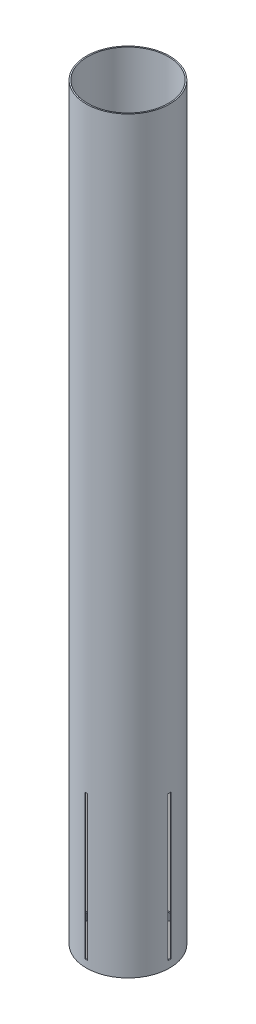
ISO-10303-21;
HEADER;
FILE_DESCRIPTION(('STEP AP214'),'2;1');
FILE_NAME('part.step','',(''),(''),'','','');
FILE_SCHEMA(('AUTOMOTIVE_DESIGN { 1 0 10303 214 1 1 1 1 }'));
ENDSEC;
DATA;
#1=APPLICATION_CONTEXT('core data for automotive mechanical design processes');
#2=APPLICATION_PROTOCOL_DEFINITION('international standard','automotive_design',2000,#1);
#3=PRODUCT_CONTEXT('',#1,'mechanical');
#4=PRODUCT('Part','Part','',(#3));
#5=PRODUCT_RELATED_PRODUCT_CATEGORY('part','',(#4));
#6=PRODUCT_DEFINITION_FORMATION('','',#4);
#7=PRODUCT_DEFINITION_CONTEXT('part definition',#1,'design');
#8=PRODUCT_DEFINITION('design','',#6,#7);
#9=PRODUCT_DEFINITION_SHAPE('','',#8);
#10=(LENGTH_UNIT() NAMED_UNIT(*) SI_UNIT(.MILLI.,.METRE.));
#11=(NAMED_UNIT(*) PLANE_ANGLE_UNIT() SI_UNIT($,.RADIAN.));
#12=(NAMED_UNIT(*) SI_UNIT($,.STERADIAN.) SOLID_ANGLE_UNIT());
#13=UNCERTAINTY_MEASURE_WITH_UNIT(LENGTH_MEASURE(1.E-05),#10,'distance_accuracy_value','');
#14=(GEOMETRIC_REPRESENTATION_CONTEXT(3) GLOBAL_UNCERTAINTY_ASSIGNED_CONTEXT((#13)) GLOBAL_UNIT_ASSIGNED_CONTEXT((#10,
#11,#12)) REPRESENTATION_CONTEXT('',''));
#15=CARTESIAN_POINT('',(0.,0.,0.));
#16=DIRECTION('',(0.,0.,1.));
#17=DIRECTION('',(1.,0.,0.));
#18=AXIS2_PLACEMENT_3D('',#15,#16,#17);
#19=CARTESIAN_POINT('',(0.,-725.,0.));
#20=DIRECTION('',(0.,1.,0.));
#21=DIRECTION('',(0.,0.,1.));
#22=AXIS2_PLACEMENT_3D('',#19,#20,#21);
#23=CYLINDRICAL_SURFACE('',#22,80.75);
#24=CARTESIAN_POINT('',(0.,-431.,0.));
#25=DIRECTION('',(0.,1.,0.));
#26=DIRECTION('',(0.,0.,1.));
#27=AXIS2_PLACEMENT_3D('',#24,#25,#26);
#28=CIRCLE('',#27,80.75);
#29=CARTESIAN_POINT('',(80.7031597894407,-431.,-2.74999999999972));
#30=VERTEX_POINT('',#29);
#31=CARTESIAN_POINT('',(80.7031597894407,-431.,2.75000000000028));
#32=VERTEX_POINT('',#31);
#33=EDGE_CURVE('E183',#30,#32,#28,.F.);
#34=ORIENTED_EDGE('',*,*,#33,.F.);
#35=DIRECTION('',(0.,1.,0.));
#36=VECTOR('',#35,1.);
#37=CARTESIAN_POINT('',(80.7031597894407,-725.,-2.74999999999972));
#38=LINE('',#37,#36);
#39=CARTESIAN_POINT('',(80.7031597894407,-711.,-2.74999999999972));
#40=VERTEX_POINT('',#39);
#41=EDGE_CURVE('E161',#40,#30,#38,.T.);
#42=ORIENTED_EDGE('',*,*,#41,.F.);
#43=CARTESIAN_POINT('',(0.,-711.,0.));
#44=DIRECTION('',(0.,-1.,0.));
#45=DIRECTION('',(0.,0.,-1.));
#46=AXIS2_PLACEMENT_3D('',#43,#44,#45);
#47=CIRCLE('',#46,80.75);
#48=CARTESIAN_POINT('',(80.7031597894407,-711.,2.75000000000028));
#49=VERTEX_POINT('',#48);
#50=EDGE_CURVE('E165',#49,#40,#47,.F.);
#51=ORIENTED_EDGE('',*,*,#50,.F.);
#52=DIRECTION('',(0.,1.,0.));
#53=VECTOR('',#52,1.);
#54=CARTESIAN_POINT('',(80.7031597894407,-725.,2.75000000000028));
#55=LINE('',#54,#53);
#56=EDGE_CURVE('E151',#32,#49,#55,.F.);
#57=ORIENTED_EDGE('',*,*,#56,.F.);
#58=EDGE_LOOP('',(#34,#42,#51,#57));
#59=FACE_BOUND('',#58,.T.);
#60=CARTESIAN_POINT('',(-80.7031597894407,-711.,-2.75000000000028));
#61=VERTEX_POINT('',#60);
#62=CARTESIAN_POINT('',(-80.7031597894407,-711.,2.74999999999972));
#63=VERTEX_POINT('',#62);
#64=EDGE_CURVE('E172',#61,#63,#47,.F.);
#65=ORIENTED_EDGE('',*,*,#64,.F.);
#66=DIRECTION('',(0.,1.,0.));
#67=VECTOR('',#66,1.);
#68=CARTESIAN_POINT('',(-80.7031597894407,-725.,-2.75000000000028));
#69=LINE('',#68,#67);
#70=CARTESIAN_POINT('',(-80.7031597894407,-431.,-2.75000000000028));
#71=VERTEX_POINT('',#70);
#72=EDGE_CURVE('E162',#71,#61,#69,.F.);
#73=ORIENTED_EDGE('',*,*,#72,.F.);
#74=CARTESIAN_POINT('',(-80.7031597894407,-431.,2.74999999999972));
#75=VERTEX_POINT('',#74);
#76=EDGE_CURVE('E184',#75,#71,#28,.F.);
#77=ORIENTED_EDGE('',*,*,#76,.F.);
#78=DIRECTION('',(0.,1.,0.));
#79=VECTOR('',#78,1.);
#80=CARTESIAN_POINT('',(-80.7031597894407,-725.,2.74999999999972));
#81=LINE('',#80,#79);
#82=EDGE_CURVE('E186',#63,#75,#81,.T.);
#83=ORIENTED_EDGE('',*,*,#82,.F.);
#84=EDGE_LOOP('',(#65,#73,#77,#83));
#85=FACE_BOUND('',#84,.T.);
#86=CARTESIAN_POINT('',(0.,-711.,0.));
#87=DIRECTION('',(0.,-1.,0.));
#88=DIRECTION('',(0.,0.,-1.));
#89=AXIS2_PLACEMENT_3D('',#86,#87,#88);
#90=CIRCLE('',#89,80.75);
#91=CARTESIAN_POINT('',(2.75,-711.,-80.7031597894407));
#92=VERTEX_POINT('',#91);
#93=CARTESIAN_POINT('',(-2.75,-711.,-80.7031597894407));
#94=VERTEX_POINT('',#93);
#95=EDGE_CURVE('E209',#92,#94,#90,.F.);
#96=ORIENTED_EDGE('',*,*,#95,.F.);
#97=DIRECTION('',(0.,1.,0.));
#98=VECTOR('',#97,1.);
#99=CARTESIAN_POINT('',(2.75,-725.,-80.7031597894407));
#100=LINE('',#99,#98);
#101=CARTESIAN_POINT('',(2.75,-431.,-80.7031597894407));
#102=VERTEX_POINT('',#101);
#103=EDGE_CURVE('E212',#102,#92,#100,.F.);
#104=ORIENTED_EDGE('',*,*,#103,.F.);
#105=CARTESIAN_POINT('',(0.,-431.,0.));
#106=DIRECTION('',(0.,1.,0.));
#107=DIRECTION('',(0.,0.,1.));
#108=AXIS2_PLACEMENT_3D('',#105,#106,#107);
#109=CIRCLE('',#108,80.75);
#110=CARTESIAN_POINT('',(-2.75,-431.,-80.7031597894407));
#111=VERTEX_POINT('',#110);
#112=EDGE_CURVE('E216',#111,#102,#109,.F.);
#113=ORIENTED_EDGE('',*,*,#112,.F.);
#114=DIRECTION('',(0.,1.,0.));
#115=VECTOR('',#114,1.);
#116=CARTESIAN_POINT('',(-2.75,-725.,-80.7031597894407));
#117=LINE('',#116,#115);
#118=EDGE_CURVE('E218',#94,#111,#117,.T.);
#119=ORIENTED_EDGE('',*,*,#118,.F.);
#120=EDGE_LOOP('',(#96,#104,#113,#119));
#121=FACE_BOUND('',#120,.T.);
#122=CARTESIAN_POINT('',(-2.75,-711.,80.7031597894407));
#123=VERTEX_POINT('',#122);
#124=CARTESIAN_POINT('',(2.75,-711.,80.7031597894407));
#125=VERTEX_POINT('',#124);
#126=EDGE_CURVE('E206',#123,#125,#90,.F.);
#127=ORIENTED_EDGE('',*,*,#126,.F.);
#128=DIRECTION('',(0.,1.,0.));
#129=VECTOR('',#128,1.);
#130=CARTESIAN_POINT('',(-2.75,-725.,80.7031597894407));
#131=LINE('',#130,#129);
#132=CARTESIAN_POINT('',(-2.75,-431.,80.7031597894407));
#133=VERTEX_POINT('',#132);
#134=EDGE_CURVE('E220',#133,#123,#131,.F.);
#135=ORIENTED_EDGE('',*,*,#134,.F.);
#136=CARTESIAN_POINT('',(2.75,-431.,80.7031597894407));
#137=VERTEX_POINT('',#136);
#138=EDGE_CURVE('E215',#137,#133,#109,.F.);
#139=ORIENTED_EDGE('',*,*,#138,.F.);
#140=DIRECTION('',(0.,1.,0.));
#141=VECTOR('',#140,1.);
#142=CARTESIAN_POINT('',(2.75,-725.,80.7031597894407));
#143=LINE('',#142,#141);
#144=EDGE_CURVE('E208',#125,#137,#143,.T.);
#145=ORIENTED_EDGE('',*,*,#144,.F.);
#146=EDGE_LOOP('',(#127,#135,#139,#145));
#147=FACE_BOUND('',#146,.T.);
#148=CARTESIAN_POINT('',(0.,-725.,0.));
#149=DIRECTION('',(0.,1.,0.));
#150=DIRECTION('',(0.,0.,1.));
#151=AXIS2_PLACEMENT_3D('',#148,#149,#150);
#152=CIRCLE('',#151,80.75);
#153=CARTESIAN_POINT('',(0.,-725.,80.75));
#154=VERTEX_POINT('',#153);
#155=EDGE_CURVE('E231',#154,#154,#152,.T.);
#156=ORIENTED_EDGE('',*,*,#155,.T.);
#157=EDGE_LOOP('',(#156));
#158=FACE_BOUND('',#157,.T.);
#159=CARTESIAN_POINT('',(0.,725.,0.));
#160=DIRECTION('',(0.,1.,0.));
#161=DIRECTION('',(0.,0.,1.));
#162=AXIS2_PLACEMENT_3D('',#159,#160,#161);
#163=CIRCLE('',#162,80.75);
#164=CARTESIAN_POINT('',(0.,725.,80.75));
#165=VERTEX_POINT('',#164);
#166=EDGE_CURVE('E225',#165,#165,#163,.T.);
#167=ORIENTED_EDGE('',*,*,#166,.F.);
#168=EDGE_LOOP('',(#167));
#169=FACE_BOUND('',#168,.T.);
#170=ADVANCED_FACE('F38',(#59,#85,#121,#147,#158,#169),#23,.T.);
#171=CARTESIAN_POINT('',(0.,-725.,0.));
#172=DIRECTION('',(0.,1.,0.));
#173=DIRECTION('',(0.,0.,1.));
#174=AXIS2_PLACEMENT_3D('',#171,#172,#173);
#175=PLANE('',#174);
#176=CARTESIAN_POINT('',(0.,-725.,0.));
#177=DIRECTION('',(0.,1.,0.));
#178=DIRECTION('',(0.,0.,1.));
#179=AXIS2_PLACEMENT_3D('',#176,#177,#178);
#180=CIRCLE('',#179,78.35);
#181=CARTESIAN_POINT('',(0.,-725.,78.35));
#182=VERTEX_POINT('',#181);
#183=EDGE_CURVE('E228',#182,#182,#180,.T.);
#184=ORIENTED_EDGE('',*,*,#183,.T.);
#185=EDGE_LOOP('',(#184));
#186=FACE_BOUND('',#185,.T.);
#187=ORIENTED_EDGE('',*,*,#155,.F.);
#188=EDGE_LOOP('',(#187));
#189=FACE_BOUND('',#188,.T.);
#190=ADVANCED_FACE('F304',(#186,#189),#175,.F.);
#191=CARTESIAN_POINT('',(0.,-725.,0.));
#192=DIRECTION('',(0.,1.,0.));
#193=DIRECTION('',(0.,0.,1.));
#194=AXIS2_PLACEMENT_3D('',#191,#192,#193);
#195=CYLINDRICAL_SURFACE('',#194,78.35);
#196=CARTESIAN_POINT('',(0.,-431.,0.));
#197=DIRECTION('',(0.,1.,0.));
#198=DIRECTION('',(0.,0.,1.));
#199=AXIS2_PLACEMENT_3D('',#196,#197,#198);
#200=CIRCLE('',#199,78.35);
#201=CARTESIAN_POINT('',(-78.301724118949,-431.,2.74999999999973));
#202=VERTEX_POINT('',#201);
#203=CARTESIAN_POINT('',(-78.301724118949,-431.,-2.75000000000027));
#204=VERTEX_POINT('',#203);
#205=EDGE_CURVE('E180',#202,#204,#200,.F.);
#206=ORIENTED_EDGE('',*,*,#205,.T.);
#207=DIRECTION('',(0.,1.,0.));
#208=VECTOR('',#207,1.);
#209=CARTESIAN_POINT('',(-78.301724118949,-725.,-2.75000000000027));
#210=LINE('',#209,#208);
#211=CARTESIAN_POINT('',(-78.301724118949,-711.,-2.75000000000027));
#212=VERTEX_POINT('',#211);
#213=EDGE_CURVE('E11',#204,#212,#210,.F.);
#214=ORIENTED_EDGE('',*,*,#213,.T.);
#215=CARTESIAN_POINT('',(0.,-711.,0.));
#216=DIRECTION('',(0.,-1.,0.));
#217=DIRECTION('',(0.,0.,-1.));
#218=AXIS2_PLACEMENT_3D('',#215,#216,#217);
#219=CIRCLE('',#218,78.35);
#220=CARTESIAN_POINT('',(-78.301724118949,-711.,2.74999999999973));
#221=VERTEX_POINT('',#220);
#222=EDGE_CURVE('E173',#212,#221,#219,.F.);
#223=ORIENTED_EDGE('',*,*,#222,.T.);
#224=DIRECTION('',(0.,1.,0.));
#225=VECTOR('',#224,1.);
#226=CARTESIAN_POINT('',(-78.301724118949,-725.,2.74999999999973));
#227=LINE('',#226,#225);
#228=EDGE_CURVE('E45',#221,#202,#227,.T.);
#229=ORIENTED_EDGE('',*,*,#228,.T.);
#230=EDGE_LOOP('',(#206,#214,#223,#229));
#231=FACE_BOUND('',#230,.T.);
#232=DIRECTION('',(0.,1.,0.));
#233=VECTOR('',#232,1.);
#234=CARTESIAN_POINT('',(78.301724118949,-725.,-2.74999999999973));
#235=LINE('',#234,#233);
#236=CARTESIAN_POINT('',(78.301724118949,-711.,-2.74999999999973));
#237=VERTEX_POINT('',#236);
#238=CARTESIAN_POINT('',(78.301724118949,-431.,-2.74999999999973));
#239=VERTEX_POINT('',#238);
#240=EDGE_CURVE('E256',#237,#239,#235,.T.);
#241=ORIENTED_EDGE('',*,*,#240,.T.);
#242=CARTESIAN_POINT('',(78.301724118949,-431.,2.75000000000027));
#243=VERTEX_POINT('',#242);
#244=EDGE_CURVE('E175',#239,#243,#200,.F.);
#245=ORIENTED_EDGE('',*,*,#244,.T.);
#246=DIRECTION('',(0.,1.,0.));
#247=VECTOR('',#246,1.);
#248=CARTESIAN_POINT('',(78.301724118949,-725.,2.75000000000027));
#249=LINE('',#248,#247);
#250=CARTESIAN_POINT('',(78.301724118949,-711.,2.75000000000027));
#251=VERTEX_POINT('',#250);
#252=EDGE_CURVE('E254',#243,#251,#249,.F.);
#253=ORIENTED_EDGE('',*,*,#252,.T.);
#254=EDGE_CURVE('E167',#251,#237,#219,.F.);
#255=ORIENTED_EDGE('',*,*,#254,.T.);
#256=EDGE_LOOP('',(#241,#245,#253,#255));
#257=FACE_BOUND('',#256,.T.);
#258=CARTESIAN_POINT('',(0.,-431.,0.));
#259=DIRECTION('',(0.,1.,0.));
#260=DIRECTION('',(0.,0.,1.));
#261=AXIS2_PLACEMENT_3D('',#258,#259,#260);
#262=CIRCLE('',#261,78.35);
#263=CARTESIAN_POINT('',(2.75,-431.,78.301724118949));
#264=VERTEX_POINT('',#263);
#265=CARTESIAN_POINT('',(-2.75,-431.,78.301724118949));
#266=VERTEX_POINT('',#265);
#267=EDGE_CURVE('E245',#264,#266,#262,.F.);
#268=ORIENTED_EDGE('',*,*,#267,.T.);
#269=DIRECTION('',(0.,1.,0.));
#270=VECTOR('',#269,1.);
#271=CARTESIAN_POINT('',(-2.75,-725.,78.301724118949));
#272=LINE('',#271,#270);
#273=CARTESIAN_POINT('',(-2.75,-711.,78.301724118949));
#274=VERTEX_POINT('',#273);
#275=EDGE_CURVE('E251',#266,#274,#272,.F.);
#276=ORIENTED_EDGE('',*,*,#275,.T.);
#277=CARTESIAN_POINT('',(0.,-711.,0.));
#278=DIRECTION('',(0.,-1.,0.));
#279=DIRECTION('',(0.,0.,-1.));
#280=AXIS2_PLACEMENT_3D('',#277,#278,#279);
#281=CIRCLE('',#280,78.35);
#282=CARTESIAN_POINT('',(2.75,-711.,78.301724118949));
#283=VERTEX_POINT('',#282);
#284=EDGE_CURVE('E238',#274,#283,#281,.F.);
#285=ORIENTED_EDGE('',*,*,#284,.T.);
#286=DIRECTION('',(0.,1.,0.));
#287=VECTOR('',#286,1.);
#288=CARTESIAN_POINT('',(2.75,-725.,78.301724118949));
#289=LINE('',#288,#287);
#290=EDGE_CURVE('E248',#283,#264,#289,.T.);
#291=ORIENTED_EDGE('',*,*,#290,.T.);
#292=EDGE_LOOP('',(#268,#276,#285,#291));
#293=FACE_BOUND('',#292,.T.);
#294=CARTESIAN_POINT('',(2.75,-711.,-78.301724118949));
#295=VERTEX_POINT('',#294);
#296=CARTESIAN_POINT('',(-2.75,-711.,-78.301724118949));
#297=VERTEX_POINT('',#296);
#298=EDGE_CURVE('E234',#295,#297,#281,.F.);
#299=ORIENTED_EDGE('',*,*,#298,.T.);
#300=DIRECTION('',(0.,1.,0.));
#301=VECTOR('',#300,1.);
#302=CARTESIAN_POINT('',(-2.75,-725.,-78.301724118949));
#303=LINE('',#302,#301);
#304=CARTESIAN_POINT('',(-2.75,-431.,-78.301724118949));
#305=VERTEX_POINT('',#304);
#306=EDGE_CURVE('E244',#297,#305,#303,.T.);
#307=ORIENTED_EDGE('',*,*,#306,.T.);
#308=CARTESIAN_POINT('',(2.75,-431.,-78.301724118949));
#309=VERTEX_POINT('',#308);
#310=EDGE_CURVE('E241',#305,#309,#262,.F.);
#311=ORIENTED_EDGE('',*,*,#310,.T.);
#312=DIRECTION('',(0.,1.,0.));
#313=VECTOR('',#312,1.);
#314=CARTESIAN_POINT('',(2.75,-725.,-78.301724118949));
#315=LINE('',#314,#313);
#316=EDGE_CURVE('E237',#309,#295,#315,.F.);
#317=ORIENTED_EDGE('',*,*,#316,.T.);
#318=EDGE_LOOP('',(#299,#307,#311,#317));
#319=FACE_BOUND('',#318,.T.);
#320=ORIENTED_EDGE('',*,*,#183,.F.);
#321=EDGE_LOOP('',(#320));
#322=FACE_BOUND('',#321,.T.);
#323=CARTESIAN_POINT('',(0.,725.,0.));
#324=DIRECTION('',(0.,1.,0.));
#325=DIRECTION('',(0.,0.,1.));
#326=AXIS2_PLACEMENT_3D('',#323,#324,#325);
#327=CIRCLE('',#326,78.35);
#328=CARTESIAN_POINT('',(0.,725.,78.35));
#329=VERTEX_POINT('',#328);
#330=EDGE_CURVE('E222',#329,#329,#327,.T.);
#331=ORIENTED_EDGE('',*,*,#330,.T.);
#332=EDGE_LOOP('',(#331));
#333=FACE_BOUND('',#332,.T.);
#334=ADVANCED_FACE('F260',(#231,#257,#293,#319,#322,#333),#195,.F.);
#335=CARTESIAN_POINT('',(0.,725.,0.));
#336=DIRECTION('',(0.,1.,0.));
#337=DIRECTION('',(0.,0.,1.));
#338=AXIS2_PLACEMENT_3D('',#335,#336,#337);
#339=PLANE('',#338);
#340=ORIENTED_EDGE('',*,*,#166,.T.);
#341=EDGE_LOOP('',(#340));
#342=FACE_BOUND('',#341,.T.);
#343=ORIENTED_EDGE('',*,*,#330,.F.);
#344=EDGE_LOOP('',(#343));
#345=FACE_BOUND('',#344,.T.);
#346=ADVANCED_FACE('F312',(#342,#345),#339,.T.);
#347=CARTESIAN_POINT('',(-2.75,-711.,-80.75));
#348=DIRECTION('',(0.,-1.,0.));
#349=DIRECTION('',(0.,0.,-1.));
#350=AXIS2_PLACEMENT_3D('',#347,#348,#349);
#351=PLANE('',#350);
#352=ORIENTED_EDGE('',*,*,#95,.T.);
#353=DIRECTION('',(0.,0.,1.));
#354=VECTOR('',#353,1.);
#355=CARTESIAN_POINT('',(-2.75,-711.,-80.75));
#356=LINE('',#355,#354);
#357=EDGE_CURVE('E203',#94,#297,#356,.T.);
#358=ORIENTED_EDGE('',*,*,#357,.T.);
#359=ORIENTED_EDGE('',*,*,#298,.F.);
#360=DIRECTION('',(0.,0.,1.));
#361=VECTOR('',#360,1.);
#362=CARTESIAN_POINT('',(2.75,-711.,-80.75));
#363=LINE('',#362,#361);
#364=EDGE_CURVE('E199',#92,#295,#363,.T.);
#365=ORIENTED_EDGE('',*,*,#364,.F.);
#366=EDGE_LOOP('',(#352,#358,#359,#365));
#367=FACE_BOUND('',#366,.T.);
#368=ADVANCED_FACE('F318',(#367),#351,.F.);
#369=CARTESIAN_POINT('',(2.75,-711.,-80.75));
#370=DIRECTION('',(1.,0.,0.));
#371=DIRECTION('',(0.,0.,-1.));
#372=AXIS2_PLACEMENT_3D('',#369,#370,#371);
#373=PLANE('',#372);
#374=ORIENTED_EDGE('',*,*,#103,.T.);
#375=ORIENTED_EDGE('',*,*,#364,.T.);
#376=ORIENTED_EDGE('',*,*,#316,.F.);
#377=DIRECTION('',(0.,0.,1.));
#378=VECTOR('',#377,1.);
#379=CARTESIAN_POINT('',(2.75,-431.,-80.75));
#380=LINE('',#379,#378);
#381=EDGE_CURVE('E195',#102,#309,#380,.T.);
#382=ORIENTED_EDGE('',*,*,#381,.F.);
#383=EDGE_LOOP('',(#374,#375,#376,#382));
#384=FACE_BOUND('',#383,.T.);
#385=ADVANCED_FACE('F330',(#384),#373,.F.);
#386=CARTESIAN_POINT('',(-2.75,-431.,-80.75));
#387=DIRECTION('',(0.,1.,0.));
#388=DIRECTION('',(0.,0.,1.));
#389=AXIS2_PLACEMENT_3D('',#386,#387,#388);
#390=PLANE('',#389);
#391=ORIENTED_EDGE('',*,*,#112,.T.);
#392=ORIENTED_EDGE('',*,*,#381,.T.);
#393=ORIENTED_EDGE('',*,*,#310,.F.);
#394=DIRECTION('',(0.,0.,1.));
#395=VECTOR('',#394,1.);
#396=CARTESIAN_POINT('',(-2.75,-431.,-80.75));
#397=LINE('',#396,#395);
#398=EDGE_CURVE('E194',#111,#305,#397,.T.);
#399=ORIENTED_EDGE('',*,*,#398,.F.);
#400=EDGE_LOOP('',(#391,#392,#393,#399));
#401=FACE_BOUND('',#400,.T.);
#402=ADVANCED_FACE('F333',(#401),#390,.F.);
#403=CARTESIAN_POINT('',(-2.75,-711.,-80.75));
#404=DIRECTION('',(-1.,0.,0.));
#405=DIRECTION('',(0.,0.,1.));
#406=AXIS2_PLACEMENT_3D('',#403,#404,#405);
#407=PLANE('',#406);
#408=ORIENTED_EDGE('',*,*,#118,.T.);
#409=ORIENTED_EDGE('',*,*,#398,.T.);
#410=ORIENTED_EDGE('',*,*,#306,.F.);
#411=ORIENTED_EDGE('',*,*,#357,.F.);
#412=EDGE_LOOP('',(#408,#409,#410,#411));
#413=FACE_BOUND('',#412,.T.);
#414=ADVANCED_FACE('F324',(#413),#407,.F.);
#415=ORIENTED_EDGE('',*,*,#134,.T.);
#416=EDGE_CURVE('E190',#274,#123,#356,.T.);
#417=ORIENTED_EDGE('',*,*,#416,.F.);
#418=ORIENTED_EDGE('',*,*,#275,.F.);
#419=EDGE_CURVE('E191',#266,#133,#397,.T.);
#420=ORIENTED_EDGE('',*,*,#419,.T.);
#421=EDGE_LOOP('',(#415,#417,#418,#420));
#422=FACE_BOUND('',#421,.T.);
#423=ADVANCED_FACE('F320',(#422),#407,.F.);
#424=ORIENTED_EDGE('',*,*,#138,.T.);
#425=ORIENTED_EDGE('',*,*,#419,.F.);
#426=ORIENTED_EDGE('',*,*,#267,.F.);
#427=EDGE_CURVE('E196',#264,#137,#380,.T.);
#428=ORIENTED_EDGE('',*,*,#427,.T.);
#429=EDGE_LOOP('',(#424,#425,#426,#428));
#430=FACE_BOUND('',#429,.T.);
#431=ADVANCED_FACE('F323',(#430),#390,.F.);
#432=ORIENTED_EDGE('',*,*,#144,.T.);
#433=ORIENTED_EDGE('',*,*,#427,.F.);
#434=ORIENTED_EDGE('',*,*,#290,.F.);
#435=EDGE_CURVE('E200',#283,#125,#363,.T.);
#436=ORIENTED_EDGE('',*,*,#435,.T.);
#437=EDGE_LOOP('',(#432,#433,#434,#436));
#438=FACE_BOUND('',#437,.T.);
#439=ADVANCED_FACE('F328',(#438),#373,.F.);
#440=ORIENTED_EDGE('',*,*,#126,.T.);
#441=ORIENTED_EDGE('',*,*,#435,.F.);
#442=ORIENTED_EDGE('',*,*,#284,.F.);
#443=ORIENTED_EDGE('',*,*,#416,.T.);
#444=EDGE_LOOP('',(#440,#441,#442,#443));
#445=FACE_BOUND('',#444,.T.);
#446=ADVANCED_FACE('F300',(#445),#351,.F.);
#447=CARTESIAN_POINT('',(80.7500000000003,-711.,-2.74999999999972));
#448=DIRECTION('',(0.,-1.,0.));
#449=DIRECTION('',(0.,0.,-1.));
#450=AXIS2_PLACEMENT_3D('',#447,#448,#449);
#451=PLANE('',#450);
#452=ORIENTED_EDGE('',*,*,#50,.T.);
#453=DIRECTION('',(-1.,0.,0.));
#454=VECTOR('',#453,1.);
#455=CARTESIAN_POINT('',(80.7500000000003,-711.,-2.74999999999972));
#456=LINE('',#455,#454);
#457=EDGE_CURVE('E60',#40,#237,#456,.T.);
#458=ORIENTED_EDGE('',*,*,#457,.T.);
#459=ORIENTED_EDGE('',*,*,#254,.F.);
#460=DIRECTION('',(-1.,0.,0.));
#461=VECTOR('',#460,1.);
#462=CARTESIAN_POINT('',(80.7500000000003,-711.,2.75000000000028));
#463=LINE('',#462,#461);
#464=EDGE_CURVE('E154',#49,#251,#463,.T.);
#465=ORIENTED_EDGE('',*,*,#464,.F.);
#466=EDGE_LOOP('',(#452,#458,#459,#465));
#467=FACE_BOUND('',#466,.T.);
#468=ADVANCED_FACE('F164',(#467),#451,.F.);
#469=CARTESIAN_POINT('',(80.7500000000003,-431.,-2.74999999999972));
#470=DIRECTION('',(0.,1.,0.));
#471=DIRECTION('',(0.,0.,1.));
#472=AXIS2_PLACEMENT_3D('',#469,#470,#471);
#473=PLANE('',#472);
#474=ORIENTED_EDGE('',*,*,#33,.T.);
#475=DIRECTION('',(-1.,0.,0.));
#476=VECTOR('',#475,1.);
#477=CARTESIAN_POINT('',(80.7500000000003,-431.,2.75000000000028));
#478=LINE('',#477,#476);
#479=EDGE_CURVE('E157',#32,#243,#478,.T.);
#480=ORIENTED_EDGE('',*,*,#479,.T.);
#481=ORIENTED_EDGE('',*,*,#244,.F.);
#482=DIRECTION('',(-1.,0.,0.));
#483=VECTOR('',#482,1.);
#484=CARTESIAN_POINT('',(80.7500000000003,-431.,-2.74999999999972));
#485=LINE('',#484,#483);
#486=EDGE_CURVE('E284',#30,#239,#485,.T.);
#487=ORIENTED_EDGE('',*,*,#486,.F.);
#488=EDGE_LOOP('',(#474,#480,#481,#487));
#489=FACE_BOUND('',#488,.T.);
#490=ADVANCED_FACE('F291',(#489),#473,.F.);
#491=CARTESIAN_POINT('',(80.7500000000003,-711.,2.75000000000028));
#492=DIRECTION('',(0.,0.,1.));
#493=DIRECTION('',(1.,0.,0.));
#494=AXIS2_PLACEMENT_3D('',#491,#492,#493);
#495=PLANE('',#494);
#496=ORIENTED_EDGE('',*,*,#56,.T.);
#497=ORIENTED_EDGE('',*,*,#464,.T.);
#498=ORIENTED_EDGE('',*,*,#252,.F.);
#499=ORIENTED_EDGE('',*,*,#479,.F.);
#500=EDGE_LOOP('',(#496,#497,#498,#499));
#501=FACE_BOUND('',#500,.T.);
#502=ADVANCED_FACE('F153',(#501),#495,.F.);
#503=CARTESIAN_POINT('',(80.7500000000003,-711.,-2.74999999999972));
#504=DIRECTION('',(0.,0.,-1.));
#505=DIRECTION('',(-1.,0.,0.));
#506=AXIS2_PLACEMENT_3D('',#503,#504,#505);
#507=PLANE('',#506);
#508=ORIENTED_EDGE('',*,*,#41,.T.);
#509=ORIENTED_EDGE('',*,*,#486,.T.);
#510=ORIENTED_EDGE('',*,*,#240,.F.);
#511=ORIENTED_EDGE('',*,*,#457,.F.);
#512=EDGE_LOOP('',(#508,#509,#510,#511));
#513=FACE_BOUND('',#512,.T.);
#514=ADVANCED_FACE('F298',(#513),#507,.F.);
#515=ORIENTED_EDGE('',*,*,#72,.T.);
#516=EDGE_CURVE('E272',#212,#61,#456,.T.);
#517=ORIENTED_EDGE('',*,*,#516,.F.);
#518=ORIENTED_EDGE('',*,*,#213,.F.);
#519=EDGE_CURVE('E270',#204,#71,#485,.T.);
#520=ORIENTED_EDGE('',*,*,#519,.T.);
#521=EDGE_LOOP('',(#515,#517,#518,#520));
#522=FACE_BOUND('',#521,.T.);
#523=ADVANCED_FACE('F283',(#522),#507,.F.);
#524=ORIENTED_EDGE('',*,*,#82,.T.);
#525=EDGE_CURVE('E168',#202,#75,#478,.T.);
#526=ORIENTED_EDGE('',*,*,#525,.F.);
#527=ORIENTED_EDGE('',*,*,#228,.F.);
#528=EDGE_CURVE('E52',#221,#63,#463,.T.);
#529=ORIENTED_EDGE('',*,*,#528,.T.);
#530=EDGE_LOOP('',(#524,#526,#527,#529));
#531=FACE_BOUND('',#530,.T.);
#532=ADVANCED_FACE('F264',(#531),#495,.F.);
#533=ORIENTED_EDGE('',*,*,#76,.T.);
#534=ORIENTED_EDGE('',*,*,#519,.F.);
#535=ORIENTED_EDGE('',*,*,#205,.F.);
#536=ORIENTED_EDGE('',*,*,#525,.T.);
#537=EDGE_LOOP('',(#533,#534,#535,#536));
#538=FACE_BOUND('',#537,.T.);
#539=ADVANCED_FACE('F282',(#538),#473,.F.);
#540=ORIENTED_EDGE('',*,*,#64,.T.);
#541=ORIENTED_EDGE('',*,*,#528,.F.);
#542=ORIENTED_EDGE('',*,*,#222,.F.);
#543=ORIENTED_EDGE('',*,*,#516,.T.);
#544=EDGE_LOOP('',(#540,#541,#542,#543));
#545=FACE_BOUND('',#544,.T.);
#546=ADVANCED_FACE('F276',(#545),#451,.F.);
#547=CLOSED_SHELL('',(#170,#190,#334,#346,#368,#385,#402,#414,#423,#431,#439,#446,#468,#490,
#502,#514,#523,#532,#539,#546));
#548=MANIFOLD_SOLID_BREP('B2',#547);
#549=ADVANCED_BREP_SHAPE_REPRESENTATION('',(#18,#548),#14);
#550=SHAPE_DEFINITION_REPRESENTATION(#9,#549);
ENDSEC;
END-ISO-10303-21;
